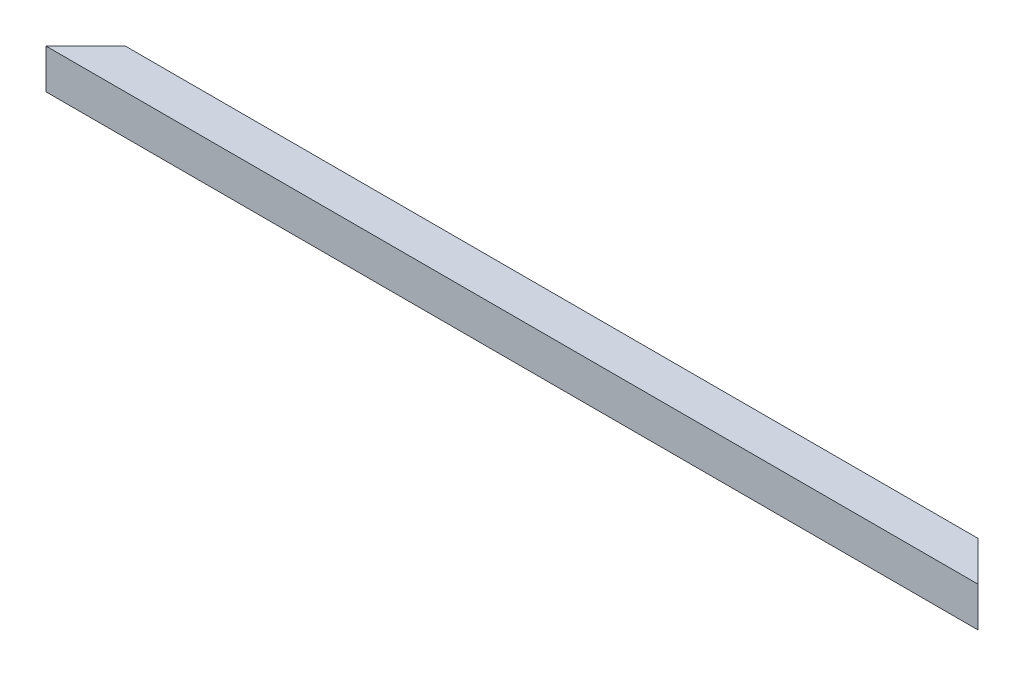
ISO-10303-21;
HEADER;
FILE_DESCRIPTION(('STEP AP214'),'2;1');
FILE_NAME('part.step','',(''),(''),'','','');
FILE_SCHEMA(('AUTOMOTIVE_DESIGN { 1 0 10303 214 1 1 1 1 }'));
ENDSEC;
DATA;
#1=APPLICATION_CONTEXT('core data for automotive mechanical design processes');
#2=APPLICATION_PROTOCOL_DEFINITION('international standard','automotive_design',2000,#1);
#3=PRODUCT_CONTEXT('',#1,'mechanical');
#4=PRODUCT('Part','Part','',(#3));
#5=PRODUCT_RELATED_PRODUCT_CATEGORY('part','',(#4));
#6=PRODUCT_DEFINITION_FORMATION('','',#4);
#7=PRODUCT_DEFINITION_CONTEXT('part definition',#1,'design');
#8=PRODUCT_DEFINITION('design','',#6,#7);
#9=PRODUCT_DEFINITION_SHAPE('','',#8);
#10=(LENGTH_UNIT() NAMED_UNIT(*) SI_UNIT(.MILLI.,.METRE.));
#11=(NAMED_UNIT(*) PLANE_ANGLE_UNIT() SI_UNIT($,.RADIAN.));
#12=(NAMED_UNIT(*) SI_UNIT($,.STERADIAN.) SOLID_ANGLE_UNIT());
#13=UNCERTAINTY_MEASURE_WITH_UNIT(LENGTH_MEASURE(1.E-05),#10,'distance_accuracy_value','');
#14=(GEOMETRIC_REPRESENTATION_CONTEXT(3) GLOBAL_UNCERTAINTY_ASSIGNED_CONTEXT((#13)) GLOBAL_UNIT_ASSIGNED_CONTEXT((#10,
#11,#12)) REPRESENTATION_CONTEXT('',''));
#15=CARTESIAN_POINT('',(0.,0.,0.));
#16=DIRECTION('',(0.,0.,1.));
#17=DIRECTION('',(1.,0.,0.));
#18=AXIS2_PLACEMENT_3D('',#15,#16,#17);
#19=CARTESIAN_POINT('',(-225.,190.,-190.));
#20=DIRECTION('',(0.,1.,0.));
#21=DIRECTION('',(0.,0.,1.));
#22=AXIS2_PLACEMENT_3D('',#19,#20,#21);
#23=PLANE('',#22);
#24=DIRECTION('',(-0.707106781186548,0.,-0.707106781186547));
#25=VECTOR('',#24,1.);
#26=CARTESIAN_POINT('',(4.99999999999998,190.,-420.));
#27=LINE('',#26,#25);
#28=CARTESIAN_POINT('',(235.,190.,-190.));
#29=VERTEX_POINT('',#28);
#30=CARTESIAN_POINT('',(215.,190.,-210.));
#31=VERTEX_POINT('',#30);
#32=EDGE_CURVE('E116',#29,#31,#27,.T.);
#33=ORIENTED_EDGE('',*,*,#32,.F.);
#34=DIRECTION('',(1.,0.,0.));
#35=VECTOR('',#34,1.);
#36=CARTESIAN_POINT('',(-225.,190.,-190.));
#37=LINE('',#36,#35);
#38=CARTESIAN_POINT('',(-235.,190.,-190.));
#39=VERTEX_POINT('',#38);
#40=EDGE_CURVE('E53',#39,#29,#37,.T.);
#41=ORIENTED_EDGE('',*,*,#40,.F.);
#42=DIRECTION('',(-0.707106781186547,0.,0.707106781186548));
#43=VECTOR('',#42,1.);
#44=CARTESIAN_POINT('',(-230.,190.,-195.));
#45=LINE('',#44,#43);
#46=CARTESIAN_POINT('',(-215.,190.,-210.));
#47=VERTEX_POINT('',#46);
#48=EDGE_CURVE('E128',#47,#39,#45,.T.);
#49=ORIENTED_EDGE('',*,*,#48,.F.);
#50=DIRECTION('',(1.,0.,0.));
#51=VECTOR('',#50,1.);
#52=CARTESIAN_POINT('',(-225.,190.,-210.));
#53=LINE('',#52,#51);
#54=EDGE_CURVE('E135',#47,#31,#53,.T.);
#55=ORIENTED_EDGE('',*,*,#54,.T.);
#56=EDGE_LOOP('',(#33,#41,#49,#55));
#57=FACE_BOUND('',#56,.T.);
#58=ADVANCED_FACE('F39',(#57),#23,.F.);
#59=CARTESIAN_POINT('',(-225.,190.,-190.));
#60=DIRECTION('',(0.,0.,-1.));
#61=DIRECTION('',(-1.,0.,0.));
#62=AXIS2_PLACEMENT_3D('',#59,#60,#61);
#63=PLANE('',#62);
#64=DIRECTION('',(0.,-1.,0.));
#65=VECTOR('',#64,1.);
#66=CARTESIAN_POINT('',(235.,190.,-190.));
#67=LINE('',#66,#65);
#68=CARTESIAN_POINT('',(235.,210.,-190.));
#69=VERTEX_POINT('',#68);
#70=EDGE_CURVE('E158',#69,#29,#67,.T.);
#71=ORIENTED_EDGE('',*,*,#70,.F.);
#72=DIRECTION('',(1.,0.,0.));
#73=VECTOR('',#72,1.);
#74=CARTESIAN_POINT('',(-225.,210.,-190.));
#75=LINE('',#74,#73);
#76=CARTESIAN_POINT('',(-235.,210.,-190.));
#77=VERTEX_POINT('',#76);
#78=EDGE_CURVE('E125',#77,#69,#75,.T.);
#79=ORIENTED_EDGE('',*,*,#78,.F.);
#80=DIRECTION('',(0.,1.,0.));
#81=VECTOR('',#80,1.);
#82=CARTESIAN_POINT('',(-235.,190.,-190.));
#83=LINE('',#82,#81);
#84=EDGE_CURVE('E173',#39,#77,#83,.T.);
#85=ORIENTED_EDGE('',*,*,#84,.F.);
#86=ORIENTED_EDGE('',*,*,#40,.T.);
#87=EDGE_LOOP('',(#71,#79,#85,#86));
#88=FACE_BOUND('',#87,.T.);
#89=ADVANCED_FACE('F181',(#88),#63,.F.);
#90=CARTESIAN_POINT('',(-225.,210.,-190.));
#91=DIRECTION('',(0.,-1.,0.));
#92=DIRECTION('',(0.,0.,-1.));
#93=AXIS2_PLACEMENT_3D('',#90,#91,#92);
#94=PLANE('',#93);
#95=DIRECTION('',(0.707106781186548,0.,0.707106781186547));
#96=VECTOR('',#95,1.);
#97=CARTESIAN_POINT('',(4.99999999999998,210.,-420.));
#98=LINE('',#97,#96);
#99=CARTESIAN_POINT('',(215.,210.,-210.));
#100=VERTEX_POINT('',#99);
#101=EDGE_CURVE('E161',#100,#69,#98,.T.);
#102=ORIENTED_EDGE('',*,*,#101,.F.);
#103=DIRECTION('',(1.,0.,0.));
#104=VECTOR('',#103,1.);
#105=CARTESIAN_POINT('',(-225.,210.,-210.));
#106=LINE('',#105,#104);
#107=CARTESIAN_POINT('',(-215.,210.,-210.));
#108=VERTEX_POINT('',#107);
#109=EDGE_CURVE('E137',#108,#100,#106,.T.);
#110=ORIENTED_EDGE('',*,*,#109,.F.);
#111=DIRECTION('',(0.707106781186547,0.,-0.707106781186548));
#112=VECTOR('',#111,1.);
#113=CARTESIAN_POINT('',(-230.,210.,-195.));
#114=LINE('',#113,#112);
#115=EDGE_CURVE('E171',#77,#108,#114,.T.);
#116=ORIENTED_EDGE('',*,*,#115,.F.);
#117=ORIENTED_EDGE('',*,*,#78,.T.);
#118=EDGE_LOOP('',(#102,#110,#116,#117));
#119=FACE_BOUND('',#118,.T.);
#120=ADVANCED_FACE('F183',(#119),#94,.F.);
#121=CARTESIAN_POINT('',(-225.,190.,-210.));
#122=DIRECTION('',(0.,0.,1.));
#123=DIRECTION('',(1.,0.,0.));
#124=AXIS2_PLACEMENT_3D('',#121,#122,#123);
#125=PLANE('',#124);
#126=DIRECTION('',(0.,1.,0.));
#127=VECTOR('',#126,1.);
#128=CARTESIAN_POINT('',(215.,190.,-210.));
#129=LINE('',#128,#127);
#130=EDGE_CURVE('E150',#31,#100,#129,.T.);
#131=ORIENTED_EDGE('',*,*,#130,.F.);
#132=ORIENTED_EDGE('',*,*,#54,.F.);
#133=DIRECTION('',(0.,-1.,0.));
#134=VECTOR('',#133,1.);
#135=CARTESIAN_POINT('',(-215.,190.,-210.));
#136=LINE('',#135,#134);
#137=EDGE_CURVE('E168',#108,#47,#136,.T.);
#138=ORIENTED_EDGE('',*,*,#137,.F.);
#139=ORIENTED_EDGE('',*,*,#109,.T.);
#140=EDGE_LOOP('',(#131,#132,#138,#139));
#141=FACE_BOUND('',#140,.T.);
#142=ADVANCED_FACE('F185',(#141),#125,.F.);
#143=CARTESIAN_POINT('',(-225.,200.,-200.));
#144=DIRECTION('',(-0.707106781186548,0.,-0.707106781186547));
#145=DIRECTION('',(-0.707106781186547,0.,0.707106781186548));
#146=AXIS2_PLACEMENT_3D('',#143,#144,#145);
#147=PLANE('',#146);
#148=DIRECTION('',(0.,-1.,0.));
#149=VECTOR('',#148,1.);
#150=CARTESIAN_POINT('',(-216.6,191.6,-208.4));
#151=LINE('',#150,#149);
#152=CARTESIAN_POINT('',(-216.6,208.4,-208.4));
#153=VERTEX_POINT('',#152);
#154=CARTESIAN_POINT('',(-216.6,191.6,-208.4));
#155=VERTEX_POINT('',#154);
#156=EDGE_CURVE('E121',#153,#155,#151,.T.);
#157=ORIENTED_EDGE('',*,*,#156,.F.);
#158=DIRECTION('',(0.707106781186547,0.,-0.707106781186548));
#159=VECTOR('',#158,1.);
#160=CARTESIAN_POINT('',(-229.2,208.4,-195.8));
#161=LINE('',#160,#159);
#162=CARTESIAN_POINT('',(-233.4,208.4,-191.6));
#163=VERTEX_POINT('',#162);
#164=EDGE_CURVE('E147',#163,#153,#161,.T.);
#165=ORIENTED_EDGE('',*,*,#164,.F.);
#166=DIRECTION('',(0.,1.,0.));
#167=VECTOR('',#166,1.);
#168=CARTESIAN_POINT('',(-233.4,191.6,-191.6));
#169=LINE('',#168,#167);
#170=CARTESIAN_POINT('',(-233.4,191.6,-191.6));
#171=VERTEX_POINT('',#170);
#172=EDGE_CURVE('E145',#171,#163,#169,.T.);
#173=ORIENTED_EDGE('',*,*,#172,.F.);
#174=DIRECTION('',(-0.707106781186547,0.,0.707106781186548));
#175=VECTOR('',#174,1.);
#176=CARTESIAN_POINT('',(-229.2,191.6,-195.8));
#177=LINE('',#176,#175);
#178=EDGE_CURVE('E46',#155,#171,#177,.T.);
#179=ORIENTED_EDGE('',*,*,#178,.F.);
#180=EDGE_LOOP('',(#157,#165,#173,#179));
#181=FACE_BOUND('',#180,.T.);
#182=ORIENTED_EDGE('',*,*,#137,.T.);
#183=ORIENTED_EDGE('',*,*,#48,.T.);
#184=ORIENTED_EDGE('',*,*,#84,.T.);
#185=ORIENTED_EDGE('',*,*,#115,.T.);
#186=EDGE_LOOP('',(#182,#183,#184,#185));
#187=FACE_BOUND('',#186,.T.);
#188=ADVANCED_FACE('F142',(#181,#187),#147,.T.);
#189=CARTESIAN_POINT('',(-225.,191.6,-208.4));
#190=DIRECTION('',(0.,0.,1.));
#191=DIRECTION('',(1.,0.,0.));
#192=AXIS2_PLACEMENT_3D('',#189,#190,#191);
#193=PLANE('',#192);
#194=DIRECTION('',(1.,0.,0.));
#195=VECTOR('',#194,1.);
#196=CARTESIAN_POINT('',(-225.,191.6,-208.4));
#197=LINE('',#196,#195);
#198=CARTESIAN_POINT('',(216.6,191.6,-208.4));
#199=VERTEX_POINT('',#198);
#200=EDGE_CURVE('E112',#155,#199,#197,.T.);
#201=ORIENTED_EDGE('',*,*,#200,.T.);
#202=DIRECTION('',(0.,1.,0.));
#203=VECTOR('',#202,1.);
#204=CARTESIAN_POINT('',(216.6,191.6,-208.4));
#205=LINE('',#204,#203);
#206=CARTESIAN_POINT('',(216.6,208.4,-208.4));
#207=VERTEX_POINT('',#206);
#208=EDGE_CURVE('E11',#199,#207,#205,.T.);
#209=ORIENTED_EDGE('',*,*,#208,.T.);
#210=DIRECTION('',(1.,0.,0.));
#211=VECTOR('',#210,1.);
#212=CARTESIAN_POINT('',(-225.,208.4,-208.4));
#213=LINE('',#212,#211);
#214=EDGE_CURVE('E133',#153,#207,#213,.T.);
#215=ORIENTED_EDGE('',*,*,#214,.F.);
#216=ORIENTED_EDGE('',*,*,#156,.T.);
#217=EDGE_LOOP('',(#201,#209,#215,#216));
#218=FACE_BOUND('',#217,.T.);
#219=ADVANCED_FACE('F120',(#218),#193,.T.);
#220=CARTESIAN_POINT('',(-225.,208.4,-191.6));
#221=DIRECTION('',(0.,-1.,0.));
#222=DIRECTION('',(0.,0.,-1.));
#223=AXIS2_PLACEMENT_3D('',#220,#221,#222);
#224=PLANE('',#223);
#225=ORIENTED_EDGE('',*,*,#214,.T.);
#226=DIRECTION('',(0.707106781186548,0.,0.707106781186547));
#227=VECTOR('',#226,1.);
#228=CARTESIAN_POINT('',(4.19999999999995,208.4,-420.8));
#229=LINE('',#228,#227);
#230=CARTESIAN_POINT('',(233.4,208.4,-191.6));
#231=VERTEX_POINT('',#230);
#232=EDGE_CURVE('E61',#207,#231,#229,.T.);
#233=ORIENTED_EDGE('',*,*,#232,.T.);
#234=DIRECTION('',(1.,0.,0.));
#235=VECTOR('',#234,1.);
#236=CARTESIAN_POINT('',(-225.,208.4,-191.6));
#237=LINE('',#236,#235);
#238=EDGE_CURVE('E123',#163,#231,#237,.T.);
#239=ORIENTED_EDGE('',*,*,#238,.F.);
#240=ORIENTED_EDGE('',*,*,#164,.T.);
#241=EDGE_LOOP('',(#225,#233,#239,#240));
#242=FACE_BOUND('',#241,.T.);
#243=ADVANCED_FACE('F224',(#242),#224,.T.);
#244=CARTESIAN_POINT('',(-225.,191.6,-191.6));
#245=DIRECTION('',(0.,0.,-1.));
#246=DIRECTION('',(-1.,0.,0.));
#247=AXIS2_PLACEMENT_3D('',#244,#245,#246);
#248=PLANE('',#247);
#249=ORIENTED_EDGE('',*,*,#238,.T.);
#250=DIRECTION('',(0.,-1.,0.));
#251=VECTOR('',#250,1.);
#252=CARTESIAN_POINT('',(233.4,191.6,-191.6));
#253=LINE('',#252,#251);
#254=CARTESIAN_POINT('',(233.4,191.6,-191.6));
#255=VERTEX_POINT('',#254);
#256=EDGE_CURVE('E117',#231,#255,#253,.T.);
#257=ORIENTED_EDGE('',*,*,#256,.T.);
#258=DIRECTION('',(1.,0.,0.));
#259=VECTOR('',#258,1.);
#260=CARTESIAN_POINT('',(-225.,191.6,-191.6));
#261=LINE('',#260,#259);
#262=EDGE_CURVE('E114',#171,#255,#261,.T.);
#263=ORIENTED_EDGE('',*,*,#262,.F.);
#264=ORIENTED_EDGE('',*,*,#172,.T.);
#265=EDGE_LOOP('',(#249,#257,#263,#264));
#266=FACE_BOUND('',#265,.T.);
#267=ADVANCED_FACE('F152',(#266),#248,.T.);
#268=CARTESIAN_POINT('',(-225.,191.6,-191.6));
#269=DIRECTION('',(0.,1.,0.));
#270=DIRECTION('',(0.,0.,1.));
#271=AXIS2_PLACEMENT_3D('',#268,#269,#270);
#272=PLANE('',#271);
#273=ORIENTED_EDGE('',*,*,#262,.T.);
#274=DIRECTION('',(-0.707106781186548,0.,-0.707106781186547));
#275=VECTOR('',#274,1.);
#276=CARTESIAN_POINT('',(4.19999999999995,191.6,-420.8));
#277=LINE('',#276,#275);
#278=EDGE_CURVE('E103',#255,#199,#277,.T.);
#279=ORIENTED_EDGE('',*,*,#278,.T.);
#280=ORIENTED_EDGE('',*,*,#200,.F.);
#281=ORIENTED_EDGE('',*,*,#178,.T.);
#282=EDGE_LOOP('',(#273,#279,#280,#281));
#283=FACE_BOUND('',#282,.T.);
#284=ADVANCED_FACE('F110',(#283),#272,.T.);
#285=CARTESIAN_POINT('',(225.,200.,-200.));
#286=DIRECTION('',(0.707106781186547,0.,-0.707106781186548));
#287=DIRECTION('',(-0.707106781186548,0.,-0.707106781186547));
#288=AXIS2_PLACEMENT_3D('',#285,#286,#287);
#289=PLANE('',#288);
#290=ORIENTED_EDGE('',*,*,#278,.F.);
#291=ORIENTED_EDGE('',*,*,#256,.F.);
#292=ORIENTED_EDGE('',*,*,#232,.F.);
#293=ORIENTED_EDGE('',*,*,#208,.F.);
#294=EDGE_LOOP('',(#290,#291,#292,#293));
#295=FACE_BOUND('',#294,.T.);
#296=ORIENTED_EDGE('',*,*,#32,.T.);
#297=ORIENTED_EDGE('',*,*,#130,.T.);
#298=ORIENTED_EDGE('',*,*,#101,.T.);
#299=ORIENTED_EDGE('',*,*,#70,.T.);
#300=EDGE_LOOP('',(#296,#297,#298,#299));
#301=FACE_BOUND('',#300,.T.);
#302=ADVANCED_FACE('F101',(#295,#301),#289,.T.);
#303=CLOSED_SHELL('',(#58,#89,#120,#142,#188,#219,#243,#267,#284,#302));
#304=MANIFOLD_SOLID_BREP('B2',#303);
#305=ADVANCED_BREP_SHAPE_REPRESENTATION('',(#18,#304),#14);
#306=SHAPE_DEFINITION_REPRESENTATION(#9,#305);
ENDSEC;
END-ISO-10303-21;
